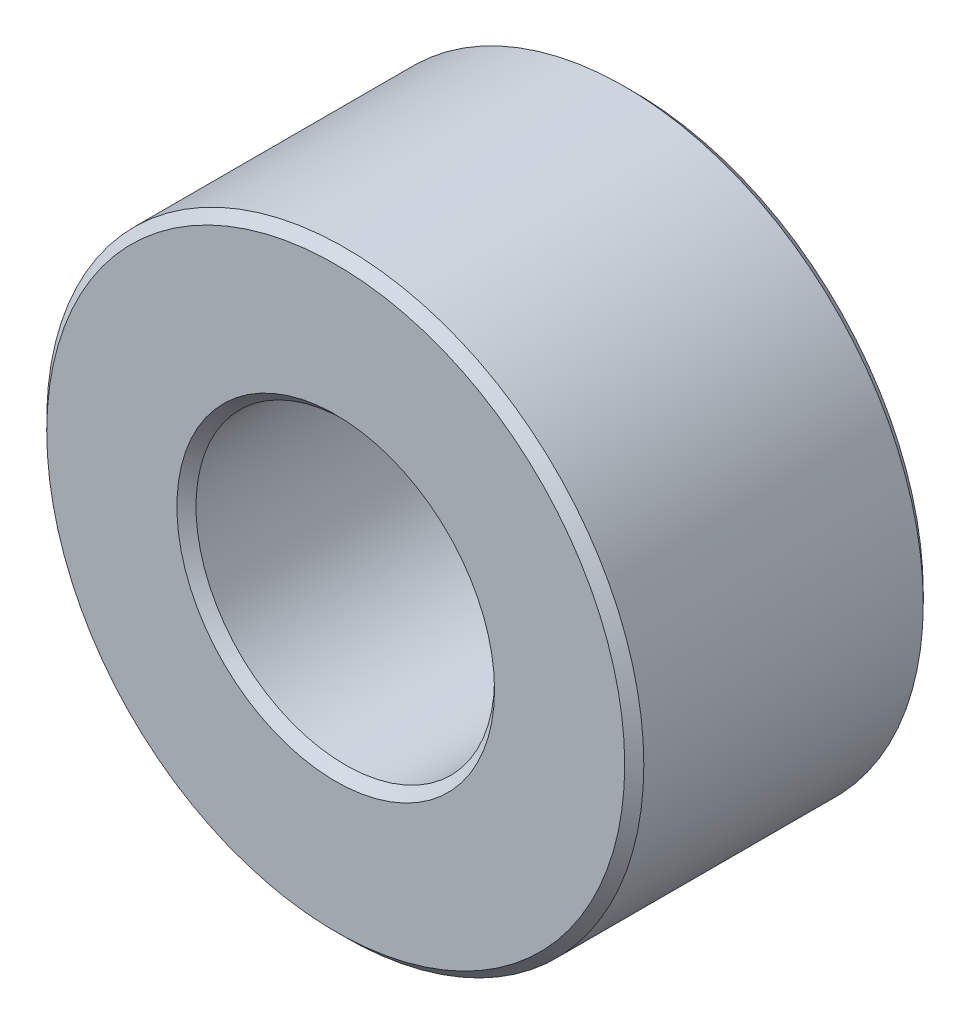
ISO-10303-21;
HEADER;
FILE_DESCRIPTION(('STEP AP214'),'2;1');
FILE_NAME('part.step','',(''),(''),'','','');
FILE_SCHEMA(('AUTOMOTIVE_DESIGN { 1 0 10303 214 1 1 1 1 }'));
ENDSEC;
DATA;
#1=APPLICATION_CONTEXT('core data for automotive mechanical design processes');
#2=APPLICATION_PROTOCOL_DEFINITION('international standard','automotive_design',2000,#1);
#3=PRODUCT_CONTEXT('',#1,'mechanical');
#4=PRODUCT('Part','Part','',(#3));
#5=PRODUCT_RELATED_PRODUCT_CATEGORY('part','',(#4));
#6=PRODUCT_DEFINITION_FORMATION('','',#4);
#7=PRODUCT_DEFINITION_CONTEXT('part definition',#1,'design');
#8=PRODUCT_DEFINITION('design','',#6,#7);
#9=PRODUCT_DEFINITION_SHAPE('','',#8);
#10=(LENGTH_UNIT() NAMED_UNIT(*) SI_UNIT(.MILLI.,.METRE.));
#11=(NAMED_UNIT(*) PLANE_ANGLE_UNIT() SI_UNIT($,.RADIAN.));
#12=(NAMED_UNIT(*) SI_UNIT($,.STERADIAN.) SOLID_ANGLE_UNIT());
#13=UNCERTAINTY_MEASURE_WITH_UNIT(LENGTH_MEASURE(1.E-05),#10,'distance_accuracy_value','');
#14=(GEOMETRIC_REPRESENTATION_CONTEXT(3) GLOBAL_UNCERTAINTY_ASSIGNED_CONTEXT((#13)) GLOBAL_UNIT_ASSIGNED_CONTEXT((#10,
#11,#12)) REPRESENTATION_CONTEXT('',''));
#15=CARTESIAN_POINT('',(0.,0.,0.));
#16=DIRECTION('',(0.,0.,1.));
#17=DIRECTION('',(1.,0.,0.));
#18=AXIS2_PLACEMENT_3D('',#15,#16,#17);
#19=CARTESIAN_POINT('',(0.,0.,7.9375));
#20=DIRECTION('',(0.,0.,-1.));
#21=DIRECTION('',(-1.,0.,0.));
#22=AXIS2_PLACEMENT_3D('',#19,#20,#21);
#23=CYLINDRICAL_SURFACE('',#22,7.9375);
#24=CARTESIAN_POINT('',(0.,0.,0.253999999999997));
#25=DIRECTION('',(0.,0.,1.));
#26=DIRECTION('',(1.,0.,0.));
#27=AXIS2_PLACEMENT_3D('',#24,#25,#26);
#28=CIRCLE('',#27,7.9375);
#29=CARTESIAN_POINT('',(7.9375,0.,0.253999999999997));
#30=VERTEX_POINT('',#29);
#31=EDGE_CURVE('E59',#30,#30,#28,.T.);
#32=ORIENTED_EDGE('',*,*,#31,.T.);
#33=EDGE_LOOP('',(#32));
#34=FACE_BOUND('',#33,.T.);
#35=CARTESIAN_POINT('',(0.,0.,7.68349999999999));
#36=DIRECTION('',(0.,0.,1.));
#37=DIRECTION('',(1.,0.,0.));
#38=AXIS2_PLACEMENT_3D('',#35,#36,#37);
#39=CIRCLE('',#38,7.9375);
#40=CARTESIAN_POINT('',(7.9375,0.,7.68349999999999));
#41=VERTEX_POINT('',#40);
#42=EDGE_CURVE('E62',#41,#41,#39,.F.);
#43=ORIENTED_EDGE('',*,*,#42,.T.);
#44=EDGE_LOOP('',(#43));
#45=FACE_BOUND('',#44,.T.);
#46=ADVANCED_FACE('F33',(#34,#45),#23,.T.);
#47=CARTESIAN_POINT('',(0.,0.,7.9375));
#48=DIRECTION('',(0.,0.,1.));
#49=DIRECTION('',(1.,0.,0.));
#50=AXIS2_PLACEMENT_3D('',#47,#48,#49);
#51=PLANE('',#50);
#52=CARTESIAN_POINT('',(0.,0.,7.9375));
#53=DIRECTION('',(0.,0.,1.));
#54=DIRECTION('',(1.,0.,0.));
#55=AXIS2_PLACEMENT_3D('',#52,#53,#54);
#56=CIRCLE('',#55,7.6835);
#57=CARTESIAN_POINT('',(7.6835,0.,7.9375));
#58=VERTEX_POINT('',#57);
#59=EDGE_CURVE('E10',#58,#58,#56,.T.);
#60=ORIENTED_EDGE('',*,*,#59,.T.);
#61=EDGE_LOOP('',(#60));
#62=FACE_BOUND('',#61,.T.);
#63=CARTESIAN_POINT('',(0.,0.,7.9375));
#64=DIRECTION('',(0.,0.,1.));
#65=DIRECTION('',(1.,0.,0.));
#66=AXIS2_PLACEMENT_3D('',#63,#64,#65);
#67=CIRCLE('',#66,4.22275);
#68=CARTESIAN_POINT('',(4.22275,0.,7.9375));
#69=VERTEX_POINT('',#68);
#70=EDGE_CURVE('E40',#69,#69,#67,.F.);
#71=ORIENTED_EDGE('',*,*,#70,.T.);
#72=EDGE_LOOP('',(#71));
#73=FACE_BOUND('',#72,.T.);
#74=ADVANCED_FACE('F80',(#62,#73),#51,.T.);
#75=CARTESIAN_POINT('',(0.,0.,0.));
#76=DIRECTION('',(0.,0.,1.));
#77=DIRECTION('',(1.,0.,0.));
#78=AXIS2_PLACEMENT_3D('',#75,#76,#77);
#79=PLANE('',#78);
#80=CARTESIAN_POINT('',(0.,0.,0.));
#81=DIRECTION('',(0.,0.,1.));
#82=DIRECTION('',(1.,0.,0.));
#83=AXIS2_PLACEMENT_3D('',#80,#81,#82);
#84=CIRCLE('',#83,7.6835);
#85=CARTESIAN_POINT('',(7.6835,0.,0.));
#86=VERTEX_POINT('',#85);
#87=EDGE_CURVE('E53',#86,#86,#84,.F.);
#88=ORIENTED_EDGE('',*,*,#87,.T.);
#89=EDGE_LOOP('',(#88));
#90=FACE_BOUND('',#89,.T.);
#91=CARTESIAN_POINT('',(0.,0.,0.));
#92=DIRECTION('',(0.,0.,1.));
#93=DIRECTION('',(1.,0.,0.));
#94=AXIS2_PLACEMENT_3D('',#91,#92,#93);
#95=CIRCLE('',#94,4.22275000000001);
#96=CARTESIAN_POINT('',(4.22275000000001,0.,0.));
#97=VERTEX_POINT('',#96);
#98=EDGE_CURVE('E56',#97,#97,#95,.T.);
#99=ORIENTED_EDGE('',*,*,#98,.T.);
#100=EDGE_LOOP('',(#99));
#101=FACE_BOUND('',#100,.T.);
#102=ADVANCED_FACE('F86',(#90,#101),#79,.F.);
#103=CARTESIAN_POINT('',(0.,0.,0.));
#104=DIRECTION('',(0.,0.,1.));
#105=DIRECTION('',(1.,0.,0.));
#106=AXIS2_PLACEMENT_3D('',#103,#104,#105);
#107=CYLINDRICAL_SURFACE('',#106,3.96875);
#108=CARTESIAN_POINT('',(0.,0.,0.254000000000006));
#109=DIRECTION('',(0.,0.,1.));
#110=DIRECTION('',(1.,0.,0.));
#111=AXIS2_PLACEMENT_3D('',#108,#109,#110);
#112=CIRCLE('',#111,3.96875);
#113=CARTESIAN_POINT('',(3.96875,0.,0.254000000000006));
#114=VERTEX_POINT('',#113);
#115=EDGE_CURVE('E44',#114,#114,#112,.F.);
#116=ORIENTED_EDGE('',*,*,#115,.T.);
#117=EDGE_LOOP('',(#116));
#118=FACE_BOUND('',#117,.T.);
#119=CARTESIAN_POINT('',(0.,0.,7.6835));
#120=DIRECTION('',(0.,0.,1.));
#121=DIRECTION('',(1.,0.,0.));
#122=AXIS2_PLACEMENT_3D('',#119,#120,#121);
#123=CIRCLE('',#122,3.96875);
#124=CARTESIAN_POINT('',(3.96875,0.,7.6835));
#125=VERTEX_POINT('',#124);
#126=EDGE_CURVE('E48',#125,#125,#123,.T.);
#127=ORIENTED_EDGE('',*,*,#126,.T.);
#128=EDGE_LOOP('',(#127));
#129=FACE_BOUND('',#128,.T.);
#130=ADVANCED_FACE('F91',(#118,#129),#107,.F.);
#131=CARTESIAN_POINT('',(0.,0.,0.253999999999997));
#132=DIRECTION('',(0.,0.,1.));
#133=DIRECTION('',(1.,0.,0.));
#134=AXIS2_PLACEMENT_3D('',#131,#132,#133);
#135=CONICAL_SURFACE('',#134,7.9375,0.785398163397448);
#136=ORIENTED_EDGE('',*,*,#87,.F.);
#137=EDGE_LOOP('',(#136));
#138=FACE_BOUND('',#137,.T.);
#139=ORIENTED_EDGE('',*,*,#31,.F.);
#140=EDGE_LOOP('',(#139));
#141=FACE_BOUND('',#140,.T.);
#142=ADVANCED_FACE('F76',(#138,#141),#135,.T.);
#143=CARTESIAN_POINT('',(0.,0.,0.));
#144=DIRECTION('',(0.,0.,-1.));
#145=DIRECTION('',(-1.,0.,0.));
#146=AXIS2_PLACEMENT_3D('',#143,#144,#145);
#147=CONICAL_SURFACE('',#146,4.22275000000001,0.785398163397448);
#148=ORIENTED_EDGE('',*,*,#115,.F.);
#149=EDGE_LOOP('',(#148));
#150=FACE_BOUND('',#149,.T.);
#151=ORIENTED_EDGE('',*,*,#98,.F.);
#152=EDGE_LOOP('',(#151));
#153=FACE_BOUND('',#152,.T.);
#154=ADVANCED_FACE('F70',(#150,#153),#147,.F.);
#155=CARTESIAN_POINT('',(0.,0.,7.9375));
#156=DIRECTION('',(0.,0.,-1.));
#157=DIRECTION('',(-1.,0.,0.));
#158=AXIS2_PLACEMENT_3D('',#155,#156,#157);
#159=CONICAL_SURFACE('',#158,7.6835,0.785398163397442);
#160=ORIENTED_EDGE('',*,*,#42,.F.);
#161=EDGE_LOOP('',(#160));
#162=FACE_BOUND('',#161,.T.);
#163=ORIENTED_EDGE('',*,*,#59,.F.);
#164=EDGE_LOOP('',(#163));
#165=FACE_BOUND('',#164,.T.);
#166=ADVANCED_FACE('F67',(#162,#165),#159,.T.);
#167=CARTESIAN_POINT('',(0.,0.,7.6835));
#168=DIRECTION('',(0.,0.,1.));
#169=DIRECTION('',(1.,0.,0.));
#170=AXIS2_PLACEMENT_3D('',#167,#168,#169);
#171=CONICAL_SURFACE('',#170,3.96875,0.785398163397452);
#172=ORIENTED_EDGE('',*,*,#70,.F.);
#173=EDGE_LOOP('',(#172));
#174=FACE_BOUND('',#173,.T.);
#175=ORIENTED_EDGE('',*,*,#126,.F.);
#176=EDGE_LOOP('',(#175));
#177=FACE_BOUND('',#176,.T.);
#178=ADVANCED_FACE('F35',(#174,#177),#171,.F.);
#179=CLOSED_SHELL('',(#46,#74,#102,#130,#142,#154,#166,#178));
#180=MANIFOLD_SOLID_BREP('B2',#179);
#181=ADVANCED_BREP_SHAPE_REPRESENTATION('',(#18,#180),#14);
#182=SHAPE_DEFINITION_REPRESENTATION(#9,#181);
ENDSEC;
END-ISO-10303-21;
